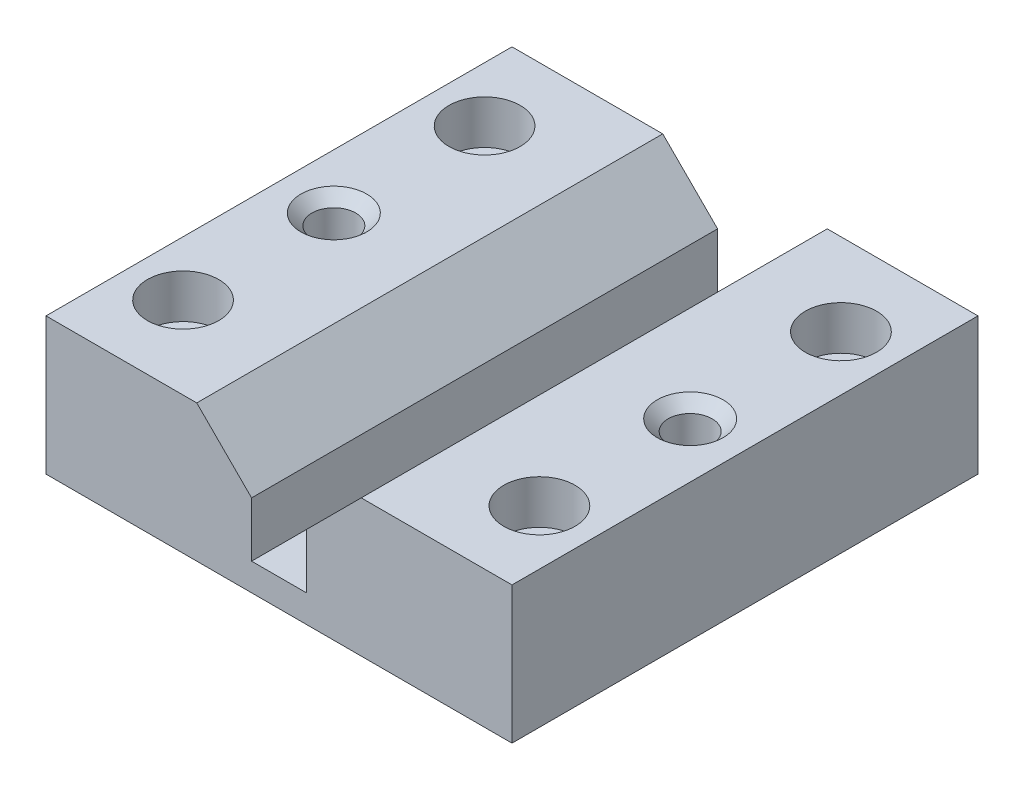
ISO-10303-21;
HEADER;
FILE_DESCRIPTION(('STEP AP214'),'2;1');
FILE_NAME('part.step','',(''),(''),'','','');
FILE_SCHEMA(('AUTOMOTIVE_DESIGN { 1 0 10303 214 1 1 1 1 }'));
ENDSEC;
DATA;
#1=APPLICATION_CONTEXT('core data for automotive mechanical design processes');
#2=APPLICATION_PROTOCOL_DEFINITION('international standard','automotive_design',2000,#1);
#3=PRODUCT_CONTEXT('',#1,'mechanical');
#4=PRODUCT('Part','Part','',(#3));
#5=PRODUCT_RELATED_PRODUCT_CATEGORY('part','',(#4));
#6=PRODUCT_DEFINITION_FORMATION('','',#4);
#7=PRODUCT_DEFINITION_CONTEXT('part definition',#1,'design');
#8=PRODUCT_DEFINITION('design','',#6,#7);
#9=PRODUCT_DEFINITION_SHAPE('','',#8);
#10=(LENGTH_UNIT() NAMED_UNIT(*) SI_UNIT(.MILLI.,.METRE.));
#11=(NAMED_UNIT(*) PLANE_ANGLE_UNIT() SI_UNIT($,.RADIAN.));
#12=(NAMED_UNIT(*) SI_UNIT($,.STERADIAN.) SOLID_ANGLE_UNIT());
#13=UNCERTAINTY_MEASURE_WITH_UNIT(LENGTH_MEASURE(1.E-05),#10,'distance_accuracy_value','');
#14=(GEOMETRIC_REPRESENTATION_CONTEXT(3) GLOBAL_UNCERTAINTY_ASSIGNED_CONTEXT((#13)) GLOBAL_UNIT_ASSIGNED_CONTEXT((#10,
#11,#12)) REPRESENTATION_CONTEXT('',''));
#15=CARTESIAN_POINT('',(0.,0.,0.));
#16=DIRECTION('',(0.,0.,1.));
#17=DIRECTION('',(1.,0.,0.));
#18=AXIS2_PLACEMENT_3D('',#15,#16,#17);
#19=CARTESIAN_POINT('',(-42.5000000000005,0.,42.5000000000005));
#20=DIRECTION('',(1.00000000000001,0.,0.));
#21=DIRECTION('',(0.,0.,-1.00000000000001));
#22=AXIS2_PLACEMENT_3D('',#19,#20,#21);
#23=PLANE('',#22);
#24=DIRECTION('',(0.,-1.,0.));
#25=VECTOR('',#24,1.);
#26=CARTESIAN_POINT('',(-42.5000000000005,0.,-42.5000000000005));
#27=LINE('',#26,#25);
#28=CARTESIAN_POINT('',(-42.5000000000005,25.,-42.5000000000005));
#29=VERTEX_POINT('',#28);
#30=CARTESIAN_POINT('',(-42.5000000000005,0.,-42.5000000000005));
#31=VERTEX_POINT('',#30);
#32=EDGE_CURVE('E144',#29,#31,#27,.T.);
#33=ORIENTED_EDGE('',*,*,#32,.T.);
#34=DIRECTION('',(0.,0.,-1.00000000000001));
#35=VECTOR('',#34,1.);
#36=CARTESIAN_POINT('',(-42.5000000000005,0.,42.5000000000005));
#37=LINE('',#36,#35);
#38=CARTESIAN_POINT('',(-42.5000000000005,0.,42.5000000000005));
#39=VERTEX_POINT('',#38);
#40=EDGE_CURVE('E182',#39,#31,#37,.T.);
#41=ORIENTED_EDGE('',*,*,#40,.F.);
#42=DIRECTION('',(0.,-1.,0.));
#43=VECTOR('',#42,1.);
#44=CARTESIAN_POINT('',(-42.5000000000005,0.,42.5000000000005));
#45=LINE('',#44,#43);
#46=CARTESIAN_POINT('',(-42.5000000000005,25.,42.5000000000005));
#47=VERTEX_POINT('',#46);
#48=EDGE_CURVE('E163',#47,#39,#45,.T.);
#49=ORIENTED_EDGE('',*,*,#48,.F.);
#50=DIRECTION('',(0.,0.,-1.00000000000001));
#51=VECTOR('',#50,1.);
#52=CARTESIAN_POINT('',(-42.5000000000005,25.,42.5000000000005));
#53=LINE('',#52,#51);
#54=EDGE_CURVE('E140',#47,#29,#53,.T.);
#55=ORIENTED_EDGE('',*,*,#54,.T.);
#56=EDGE_LOOP('',(#33,#41,#49,#55));
#57=FACE_BOUND('',#56,.T.);
#58=ADVANCED_FACE('F34',(#57),#23,.F.);
#59=CARTESIAN_POINT('',(42.5000000000005,0.,42.5000000000005));
#60=DIRECTION('',(0.,1.,0.));
#61=DIRECTION('',(0.,0.,1.00000000000001));
#62=AXIS2_PLACEMENT_3D('',#59,#60,#61);
#63=PLANE('',#62);
#64=CARTESIAN_POINT('',(-32.5000000000005,0.,27.5000000000004));
#65=DIRECTION('',(0.,1.,0.));
#66=DIRECTION('',(0.,0.,1.00000000000001));
#67=AXIS2_PLACEMENT_3D('',#64,#65,#66);
#68=CIRCLE('',#67,4.);
#69=CARTESIAN_POINT('',(-32.5000000000005,0.,31.5000000000005));
#70=VERTEX_POINT('',#69);
#71=EDGE_CURVE('E202',#70,#70,#68,.T.);
#72=ORIENTED_EDGE('',*,*,#71,.T.);
#73=EDGE_LOOP('',(#72));
#74=FACE_BOUND('',#73,.T.);
#75=CARTESIAN_POINT('',(32.5000000000005,0.,27.5000000000004));
#76=DIRECTION('',(0.,1.,0.));
#77=DIRECTION('',(0.,0.,1.00000000000001));
#78=AXIS2_PLACEMENT_3D('',#75,#76,#77);
#79=CIRCLE('',#78,4.00000000000001);
#80=CARTESIAN_POINT('',(32.5000000000005,0.,31.5000000000005));
#81=VERTEX_POINT('',#80);
#82=EDGE_CURVE('E198',#81,#81,#79,.T.);
#83=ORIENTED_EDGE('',*,*,#82,.T.);
#84=EDGE_LOOP('',(#83));
#85=FACE_BOUND('',#84,.T.);
#86=CARTESIAN_POINT('',(32.5000000000005,0.,0.));
#87=DIRECTION('',(0.,1.,0.));
#88=DIRECTION('',(0.,0.,1.00000000000001));
#89=AXIS2_PLACEMENT_3D('',#86,#87,#88);
#90=CIRCLE('',#89,4.00000000000001);
#91=CARTESIAN_POINT('',(32.5000000000005,0.,4.00000000000006));
#92=VERTEX_POINT('',#91);
#93=EDGE_CURVE('E197',#92,#92,#90,.T.);
#94=ORIENTED_EDGE('',*,*,#93,.T.);
#95=EDGE_LOOP('',(#94));
#96=FACE_BOUND('',#95,.T.);
#97=CARTESIAN_POINT('',(32.5000000000005,0.,-27.5000000000005));
#98=DIRECTION('',(0.,1.,0.));
#99=DIRECTION('',(0.,0.,1.00000000000001));
#100=AXIS2_PLACEMENT_3D('',#97,#98,#99);
#101=CIRCLE('',#100,4.00000000000001);
#102=CARTESIAN_POINT('',(32.5000000000005,0.,-23.5000000000004));
#103=VERTEX_POINT('',#102);
#104=EDGE_CURVE('E193',#103,#103,#101,.T.);
#105=ORIENTED_EDGE('',*,*,#104,.T.);
#106=EDGE_LOOP('',(#105));
#107=FACE_BOUND('',#106,.T.);
#108=CARTESIAN_POINT('',(-32.5000000000005,0.,-27.5000000000005));
#109=DIRECTION('',(0.,1.,0.));
#110=DIRECTION('',(0.,0.,1.00000000000001));
#111=AXIS2_PLACEMENT_3D('',#108,#109,#110);
#112=CIRCLE('',#111,4.);
#113=CARTESIAN_POINT('',(-32.5000000000005,0.,-23.5000000000004));
#114=VERTEX_POINT('',#113);
#115=EDGE_CURVE('E189',#114,#114,#112,.T.);
#116=ORIENTED_EDGE('',*,*,#115,.T.);
#117=EDGE_LOOP('',(#116));
#118=FACE_BOUND('',#117,.T.);
#119=CARTESIAN_POINT('',(-32.5000000000005,0.,0.));
#120=DIRECTION('',(0.,1.,0.));
#121=DIRECTION('',(0.,0.,1.00000000000001));
#122=AXIS2_PLACEMENT_3D('',#119,#120,#121);
#123=CIRCLE('',#122,4.);
#124=CARTESIAN_POINT('',(-32.5000000000005,0.,4.00000000000006));
#125=VERTEX_POINT('',#124);
#126=EDGE_CURVE('E188',#125,#125,#123,.T.);
#127=ORIENTED_EDGE('',*,*,#126,.T.);
#128=EDGE_LOOP('',(#127));
#129=FACE_BOUND('',#128,.T.);
#130=DIRECTION('',(1.00000000000001,0.,0.));
#131=VECTOR('',#130,1.);
#132=CARTESIAN_POINT('',(42.5000000000005,0.,-42.5000000000005));
#133=LINE('',#132,#131);
#134=CARTESIAN_POINT('',(42.5000000000005,0.,-42.5000000000005));
#135=VERTEX_POINT('',#134);
#136=EDGE_CURVE('E147',#31,#135,#133,.T.);
#137=ORIENTED_EDGE('',*,*,#136,.T.);
#138=DIRECTION('',(0.,0.,-1.00000000000001));
#139=VECTOR('',#138,1.);
#140=CARTESIAN_POINT('',(42.5000000000005,0.,42.5000000000005));
#141=LINE('',#140,#139);
#142=CARTESIAN_POINT('',(42.5000000000005,0.,42.5000000000005));
#143=VERTEX_POINT('',#142);
#144=EDGE_CURVE('E179',#143,#135,#141,.T.);
#145=ORIENTED_EDGE('',*,*,#144,.F.);
#146=DIRECTION('',(1.00000000000001,0.,0.));
#147=VECTOR('',#146,1.);
#148=CARTESIAN_POINT('',(42.5000000000005,0.,42.5000000000005));
#149=LINE('',#148,#147);
#150=EDGE_CURVE('E101',#39,#143,#149,.T.);
#151=ORIENTED_EDGE('',*,*,#150,.F.);
#152=ORIENTED_EDGE('',*,*,#40,.T.);
#153=EDGE_LOOP('',(#137,#145,#151,#152));
#154=FACE_BOUND('',#153,.T.);
#155=ADVANCED_FACE('F223',(#74,#85,#96,#107,#118,#129,#154),#63,.F.);
#156=CARTESIAN_POINT('',(42.5000000000005,0.,42.5000000000005));
#157=DIRECTION('',(-1.00000000000001,0.,0.));
#158=DIRECTION('',(0.,0.,1.00000000000001));
#159=AXIS2_PLACEMENT_3D('',#156,#157,#158);
#160=PLANE('',#159);
#161=DIRECTION('',(0.,1.,0.));
#162=VECTOR('',#161,1.);
#163=CARTESIAN_POINT('',(42.5000000000005,0.,-42.5000000000005));
#164=LINE('',#163,#162);
#165=CARTESIAN_POINT('',(42.5000000000005,25.,-42.5000000000005));
#166=VERTEX_POINT('',#165);
#167=EDGE_CURVE('E150',#135,#166,#164,.T.);
#168=ORIENTED_EDGE('',*,*,#167,.T.);
#169=DIRECTION('',(0.,0.,-1.00000000000001));
#170=VECTOR('',#169,1.);
#171=CARTESIAN_POINT('',(42.5000000000005,25.,42.5000000000005));
#172=LINE('',#171,#170);
#173=CARTESIAN_POINT('',(42.5000000000005,25.,42.5000000000005));
#174=VERTEX_POINT('',#173);
#175=EDGE_CURVE('E176',#174,#166,#172,.T.);
#176=ORIENTED_EDGE('',*,*,#175,.F.);
#177=DIRECTION('',(0.,1.,0.));
#178=VECTOR('',#177,1.);
#179=CARTESIAN_POINT('',(42.5000000000005,0.,42.5000000000005));
#180=LINE('',#179,#178);
#181=EDGE_CURVE('E361',#143,#174,#180,.T.);
#182=ORIENTED_EDGE('',*,*,#181,.F.);
#183=ORIENTED_EDGE('',*,*,#144,.T.);
#184=EDGE_LOOP('',(#168,#176,#182,#183));
#185=FACE_BOUND('',#184,.T.);
#186=ADVANCED_FACE('F229',(#185),#160,.F.);
#187=CARTESIAN_POINT('',(42.5000000000005,25.,42.5000000000005));
#188=DIRECTION('',(0.,-1.,0.));
#189=DIRECTION('',(0.,0.,-1.00000000000001));
#190=AXIS2_PLACEMENT_3D('',#187,#188,#189);
#191=PLANE('',#190);
#192=CARTESIAN_POINT('',(32.5000000000005,25.,0.));
#193=DIRECTION('',(0.,-1.,0.));
#194=DIRECTION('',(0.,0.,-1.00000000000001));
#195=AXIS2_PLACEMENT_3D('',#192,#193,#194);
#196=CIRCLE('',#195,5.99999999999999);
#197=CARTESIAN_POINT('',(32.5000000000005,25.,-6.00000000000008));
#198=VERTEX_POINT('',#197);
#199=EDGE_CURVE('E11',#198,#198,#196,.T.);
#200=ORIENTED_EDGE('',*,*,#199,.T.);
#201=EDGE_LOOP('',(#200));
#202=FACE_BOUND('',#201,.T.);
#203=CARTESIAN_POINT('',(32.5000000000005,25.,-27.5000000000005));
#204=DIRECTION('',(0.,1.,0.));
#205=DIRECTION('',(0.,0.,1.00000000000001));
#206=AXIS2_PLACEMENT_3D('',#203,#204,#205);
#207=CIRCLE('',#206,6.5);
#208=CARTESIAN_POINT('',(32.5000000000005,25.,-21.0000000000004));
#209=VERTEX_POINT('',#208);
#210=EDGE_CURVE('E336',#209,#209,#207,.T.);
#211=ORIENTED_EDGE('',*,*,#210,.F.);
#212=EDGE_LOOP('',(#211));
#213=FACE_BOUND('',#212,.T.);
#214=CARTESIAN_POINT('',(32.5000000000005,25.,27.5000000000004));
#215=DIRECTION('',(0.,1.,0.));
#216=DIRECTION('',(0.,0.,1.00000000000001));
#217=AXIS2_PLACEMENT_3D('',#214,#215,#216);
#218=CIRCLE('',#217,6.5);
#219=CARTESIAN_POINT('',(32.5000000000005,25.,34.0000000000005));
#220=VERTEX_POINT('',#219);
#221=EDGE_CURVE('E340',#220,#220,#218,.T.);
#222=ORIENTED_EDGE('',*,*,#221,.F.);
#223=EDGE_LOOP('',(#222));
#224=FACE_BOUND('',#223,.T.);
#225=DIRECTION('',(-1.00000000000001,0.,0.));
#226=VECTOR('',#225,1.);
#227=CARTESIAN_POINT('',(42.5000000000005,25.,-42.5000000000005));
#228=LINE('',#227,#226);
#229=CARTESIAN_POINT('',(15.0000000000002,25.,-42.5000000000005));
#230=VERTEX_POINT('',#229);
#231=EDGE_CURVE('E152',#166,#230,#228,.T.);
#232=ORIENTED_EDGE('',*,*,#231,.T.);
#233=DIRECTION('',(0.,0.,-1.00000000000001));
#234=VECTOR('',#233,1.);
#235=CARTESIAN_POINT('',(15.0000000000002,25.,42.5000000000005));
#236=LINE('',#235,#234);
#237=CARTESIAN_POINT('',(15.0000000000002,25.,42.5000000000005));
#238=VERTEX_POINT('',#237);
#239=EDGE_CURVE('E173',#238,#230,#236,.T.);
#240=ORIENTED_EDGE('',*,*,#239,.F.);
#241=DIRECTION('',(-1.00000000000001,0.,0.));
#242=VECTOR('',#241,1.);
#243=CARTESIAN_POINT('',(42.5000000000005,25.,42.5000000000005));
#244=LINE('',#243,#242);
#245=EDGE_CURVE('E363',#174,#238,#244,.T.);
#246=ORIENTED_EDGE('',*,*,#245,.F.);
#247=ORIENTED_EDGE('',*,*,#175,.T.);
#248=EDGE_LOOP('',(#232,#240,#246,#247));
#249=FACE_BOUND('',#248,.T.);
#250=ADVANCED_FACE('F235',(#202,#213,#224,#249),#191,.F.);
#251=CARTESIAN_POINT('',(15.0000000000002,25.,42.5000000000005));
#252=DIRECTION('',(0.707106781186559,-0.707106781186544,0.));
#253=DIRECTION('',(0.707106781186551,0.707106781186551,0.));
#254=AXIS2_PLACEMENT_3D('',#251,#252,#253);
#255=PLANE('',#254);
#256=DIRECTION('',(-0.707106781186551,-0.707106781186551,0.));
#257=VECTOR('',#256,1.);
#258=CARTESIAN_POINT('',(15.0000000000002,25.,-42.5000000000005));
#259=LINE('',#258,#257);
#260=CARTESIAN_POINT('',(5.00000000000007,14.9999999999999,-42.5000000000005));
#261=VERTEX_POINT('',#260);
#262=EDGE_CURVE('E154',#230,#261,#259,.T.);
#263=ORIENTED_EDGE('',*,*,#262,.T.);
#264=DIRECTION('',(0.,0.,-1.00000000000001));
#265=VECTOR('',#264,1.);
#266=CARTESIAN_POINT('',(5.00000000000007,14.9999999999999,42.5000000000005));
#267=LINE('',#266,#265);
#268=CARTESIAN_POINT('',(5.00000000000007,14.9999999999999,42.5000000000005));
#269=VERTEX_POINT('',#268);
#270=EDGE_CURVE('E170',#269,#261,#267,.T.);
#271=ORIENTED_EDGE('',*,*,#270,.F.);
#272=DIRECTION('',(-0.707106781186551,-0.707106781186551,0.));
#273=VECTOR('',#272,1.);
#274=CARTESIAN_POINT('',(15.0000000000002,25.,42.5000000000005));
#275=LINE('',#274,#273);
#276=EDGE_CURVE('E365',#238,#269,#275,.T.);
#277=ORIENTED_EDGE('',*,*,#276,.F.);
#278=ORIENTED_EDGE('',*,*,#239,.T.);
#279=EDGE_LOOP('',(#263,#271,#277,#278));
#280=FACE_BOUND('',#279,.T.);
#281=ADVANCED_FACE('F239',(#280),#255,.F.);
#282=CARTESIAN_POINT('',(5.00000000000007,14.9999999999999,42.5000000000005));
#283=DIRECTION('',(1.00000000000001,0.,0.));
#284=DIRECTION('',(0.,1.,0.));
#285=AXIS2_PLACEMENT_3D('',#282,#283,#284);
#286=PLANE('',#285);
#287=DIRECTION('',(0.,-1.,0.));
#288=VECTOR('',#287,1.);
#289=CARTESIAN_POINT('',(5.00000000000007,14.9999999999999,-42.5000000000005));
#290=LINE('',#289,#288);
#291=CARTESIAN_POINT('',(5.00000000000008,5.,-42.5000000000005));
#292=VERTEX_POINT('',#291);
#293=EDGE_CURVE('E156',#261,#292,#290,.T.);
#294=ORIENTED_EDGE('',*,*,#293,.T.);
#295=DIRECTION('',(0.,0.,-1.00000000000001));
#296=VECTOR('',#295,1.);
#297=CARTESIAN_POINT('',(5.00000000000008,5.,42.5000000000005));
#298=LINE('',#297,#296);
#299=CARTESIAN_POINT('',(5.00000000000008,5.,42.5000000000005));
#300=VERTEX_POINT('',#299);
#301=EDGE_CURVE('E167',#300,#292,#298,.T.);
#302=ORIENTED_EDGE('',*,*,#301,.F.);
#303=DIRECTION('',(0.,-1.,0.));
#304=VECTOR('',#303,1.);
#305=CARTESIAN_POINT('',(5.00000000000007,14.9999999999999,42.5000000000005));
#306=LINE('',#305,#304);
#307=EDGE_CURVE('E367',#269,#300,#306,.T.);
#308=ORIENTED_EDGE('',*,*,#307,.F.);
#309=ORIENTED_EDGE('',*,*,#270,.T.);
#310=EDGE_LOOP('',(#294,#302,#308,#309));
#311=FACE_BOUND('',#310,.T.);
#312=ADVANCED_FACE('F243',(#311),#286,.F.);
#313=CARTESIAN_POINT('',(-5.00000000000013,5.,42.5000000000005));
#314=DIRECTION('',(0.,-1.,0.));
#315=DIRECTION('',(0.,0.,-1.00000000000001));
#316=AXIS2_PLACEMENT_3D('',#313,#314,#315);
#317=PLANE('',#316);
#318=DIRECTION('',(-1.00000000000001,0.,0.));
#319=VECTOR('',#318,1.);
#320=CARTESIAN_POINT('',(-5.00000000000013,5.,-42.5000000000005));
#321=LINE('',#320,#319);
#322=CARTESIAN_POINT('',(-5.00000000000013,5.,-42.5000000000005));
#323=VERTEX_POINT('',#322);
#324=EDGE_CURVE('E158',#292,#323,#321,.T.);
#325=ORIENTED_EDGE('',*,*,#324,.T.);
#326=DIRECTION('',(0.,0.,-1.00000000000001));
#327=VECTOR('',#326,1.);
#328=CARTESIAN_POINT('',(-5.00000000000013,5.,42.5000000000005));
#329=LINE('',#328,#327);
#330=CARTESIAN_POINT('',(-5.00000000000013,5.,42.5000000000005));
#331=VERTEX_POINT('',#330);
#332=EDGE_CURVE('E135',#331,#323,#329,.T.);
#333=ORIENTED_EDGE('',*,*,#332,.F.);
#334=DIRECTION('',(-1.00000000000001,0.,0.));
#335=VECTOR('',#334,1.);
#336=CARTESIAN_POINT('',(-5.00000000000013,5.,42.5000000000005));
#337=LINE('',#336,#335);
#338=EDGE_CURVE('E126',#300,#331,#337,.T.);
#339=ORIENTED_EDGE('',*,*,#338,.F.);
#340=ORIENTED_EDGE('',*,*,#301,.T.);
#341=EDGE_LOOP('',(#325,#333,#339,#340));
#342=FACE_BOUND('',#341,.T.);
#343=ADVANCED_FACE('F247',(#342),#317,.F.);
#344=CARTESIAN_POINT('',(-5.00000000000013,14.9999999999999,42.5000000000005));
#345=DIRECTION('',(-1.00000000000001,0.,0.));
#346=DIRECTION('',(0.,-1.,0.));
#347=AXIS2_PLACEMENT_3D('',#344,#345,#346);
#348=PLANE('',#347);
#349=DIRECTION('',(0.,1.,0.));
#350=VECTOR('',#349,1.);
#351=CARTESIAN_POINT('',(-5.00000000000013,14.9999999999999,-42.5000000000005));
#352=LINE('',#351,#350);
#353=CARTESIAN_POINT('',(-5.00000000000013,14.9999999999999,-42.5000000000005));
#354=VERTEX_POINT('',#353);
#355=EDGE_CURVE('E134',#323,#354,#352,.T.);
#356=ORIENTED_EDGE('',*,*,#355,.T.);
#357=DIRECTION('',(0.,0.,-1.00000000000001));
#358=VECTOR('',#357,1.);
#359=CARTESIAN_POINT('',(-5.00000000000013,14.9999999999999,42.5000000000005));
#360=LINE('',#359,#358);
#361=CARTESIAN_POINT('',(-5.00000000000013,14.9999999999999,42.5000000000005));
#362=VERTEX_POINT('',#361);
#363=EDGE_CURVE('E131',#362,#354,#360,.T.);
#364=ORIENTED_EDGE('',*,*,#363,.F.);
#365=DIRECTION('',(0.,1.,0.));
#366=VECTOR('',#365,1.);
#367=CARTESIAN_POINT('',(-5.00000000000013,14.9999999999999,42.5000000000005));
#368=LINE('',#367,#366);
#369=EDGE_CURVE('E120',#331,#362,#368,.T.);
#370=ORIENTED_EDGE('',*,*,#369,.F.);
#371=ORIENTED_EDGE('',*,*,#332,.T.);
#372=EDGE_LOOP('',(#356,#364,#370,#371));
#373=FACE_BOUND('',#372,.T.);
#374=ADVANCED_FACE('F132',(#373),#348,.F.);
#375=CARTESIAN_POINT('',(-15.0000000000002,25.,42.5000000000005));
#376=DIRECTION('',(-0.707106781186559,-0.707106781186544,0.));
#377=DIRECTION('',(0.707106781186551,-0.707106781186551,0.));
#378=AXIS2_PLACEMENT_3D('',#375,#376,#377);
#379=PLANE('',#378);
#380=DIRECTION('',(-0.707106781186551,0.707106781186551,0.));
#381=VECTOR('',#380,1.);
#382=CARTESIAN_POINT('',(-15.0000000000002,25.,-42.5000000000005));
#383=LINE('',#382,#381);
#384=CARTESIAN_POINT('',(-15.0000000000002,25.,-42.5000000000005));
#385=VERTEX_POINT('',#384);
#386=EDGE_CURVE('E86',#354,#385,#383,.T.);
#387=ORIENTED_EDGE('',*,*,#386,.T.);
#388=DIRECTION('',(0.,0.,-1.00000000000001));
#389=VECTOR('',#388,1.);
#390=CARTESIAN_POINT('',(-15.0000000000002,25.,42.5000000000005));
#391=LINE('',#390,#389);
#392=CARTESIAN_POINT('',(-15.0000000000002,25.,42.5000000000005));
#393=VERTEX_POINT('',#392);
#394=EDGE_CURVE('E136',#393,#385,#391,.T.);
#395=ORIENTED_EDGE('',*,*,#394,.F.);
#396=DIRECTION('',(-0.707106781186551,0.707106781186551,0.));
#397=VECTOR('',#396,1.);
#398=CARTESIAN_POINT('',(-15.0000000000002,25.,42.5000000000005));
#399=LINE('',#398,#397);
#400=EDGE_CURVE('E124',#362,#393,#399,.T.);
#401=ORIENTED_EDGE('',*,*,#400,.F.);
#402=ORIENTED_EDGE('',*,*,#363,.T.);
#403=EDGE_LOOP('',(#387,#395,#401,#402));
#404=FACE_BOUND('',#403,.T.);
#405=ADVANCED_FACE('F138',(#404),#379,.F.);
#406=CARTESIAN_POINT('',(-42.5000000000005,25.,42.5000000000005));
#407=DIRECTION('',(0.,-1.,0.));
#408=DIRECTION('',(0.,0.,-1.00000000000001));
#409=AXIS2_PLACEMENT_3D('',#406,#407,#408);
#410=PLANE('',#409);
#411=CARTESIAN_POINT('',(-32.5000000000005,25.,0.));
#412=DIRECTION('',(0.,-1.,0.));
#413=DIRECTION('',(0.,0.,-1.00000000000001));
#414=AXIS2_PLACEMENT_3D('',#411,#412,#413);
#415=CIRCLE('',#414,5.99999999999999);
#416=CARTESIAN_POINT('',(-32.5000000000005,25.,-6.00000000000008));
#417=VERTEX_POINT('',#416);
#418=EDGE_CURVE('E205',#417,#417,#415,.T.);
#419=ORIENTED_EDGE('',*,*,#418,.T.);
#420=EDGE_LOOP('',(#419));
#421=FACE_BOUND('',#420,.T.);
#422=CARTESIAN_POINT('',(-32.5000000000005,25.,27.5000000000004));
#423=DIRECTION('',(0.,1.,0.));
#424=DIRECTION('',(0.,0.,1.00000000000001));
#425=AXIS2_PLACEMENT_3D('',#422,#423,#424);
#426=CIRCLE('',#425,6.5);
#427=CARTESIAN_POINT('',(-32.5000000000005,25.,34.0000000000005));
#428=VERTEX_POINT('',#427);
#429=EDGE_CURVE('E346',#428,#428,#426,.T.);
#430=ORIENTED_EDGE('',*,*,#429,.F.);
#431=EDGE_LOOP('',(#430));
#432=FACE_BOUND('',#431,.T.);
#433=CARTESIAN_POINT('',(-32.5000000000005,25.,-27.5000000000005));
#434=DIRECTION('',(0.,1.,0.));
#435=DIRECTION('',(0.,0.,1.00000000000001));
#436=AXIS2_PLACEMENT_3D('',#433,#434,#435);
#437=CIRCLE('',#436,6.5);
#438=CARTESIAN_POINT('',(-32.5000000000005,25.,-21.0000000000004));
#439=VERTEX_POINT('',#438);
#440=EDGE_CURVE('E352',#439,#439,#437,.T.);
#441=ORIENTED_EDGE('',*,*,#440,.F.);
#442=EDGE_LOOP('',(#441));
#443=FACE_BOUND('',#442,.T.);
#444=DIRECTION('',(-1.00000000000001,0.,0.));
#445=VECTOR('',#444,1.);
#446=CARTESIAN_POINT('',(-42.5000000000005,25.,-42.5000000000005));
#447=LINE('',#446,#445);
#448=EDGE_CURVE('E92',#385,#29,#447,.T.);
#449=ORIENTED_EDGE('',*,*,#448,.T.);
#450=ORIENTED_EDGE('',*,*,#54,.F.);
#451=DIRECTION('',(-1.00000000000001,0.,0.));
#452=VECTOR('',#451,1.);
#453=CARTESIAN_POINT('',(-42.5000000000005,25.,42.5000000000005));
#454=LINE('',#453,#452);
#455=EDGE_CURVE('E51',#393,#47,#454,.T.);
#456=ORIENTED_EDGE('',*,*,#455,.F.);
#457=ORIENTED_EDGE('',*,*,#394,.T.);
#458=EDGE_LOOP('',(#449,#450,#456,#457));
#459=FACE_BOUND('',#458,.T.);
#460=ADVANCED_FACE('F256',(#421,#432,#443,#459),#410,.F.);
#461=CARTESIAN_POINT('',(0.,0.,42.5000000000005));
#462=DIRECTION('',(0.,0.,-1.00000000000001));
#463=DIRECTION('',(-1.00000000000001,0.,0.));
#464=AXIS2_PLACEMENT_3D('',#461,#462,#463);
#465=PLANE('',#464);
#466=ORIENTED_EDGE('',*,*,#48,.T.);
#467=ORIENTED_EDGE('',*,*,#150,.T.);
#468=ORIENTED_EDGE('',*,*,#181,.T.);
#469=ORIENTED_EDGE('',*,*,#245,.T.);
#470=ORIENTED_EDGE('',*,*,#276,.T.);
#471=ORIENTED_EDGE('',*,*,#307,.T.);
#472=ORIENTED_EDGE('',*,*,#338,.T.);
#473=ORIENTED_EDGE('',*,*,#369,.T.);
#474=ORIENTED_EDGE('',*,*,#400,.T.);
#475=ORIENTED_EDGE('',*,*,#455,.T.);
#476=EDGE_LOOP('',(#466,#467,#468,#469,#470,#471,#472,#473,#474,#475));
#477=FACE_BOUND('',#476,.T.);
#478=ADVANCED_FACE('F122',(#477),#465,.F.);
#479=CARTESIAN_POINT('',(0.,0.,-42.5000000000005));
#480=DIRECTION('',(0.,0.,-1.00000000000001));
#481=DIRECTION('',(-1.00000000000001,0.,0.));
#482=AXIS2_PLACEMENT_3D('',#479,#480,#481);
#483=PLANE('',#482);
#484=ORIENTED_EDGE('',*,*,#32,.F.);
#485=ORIENTED_EDGE('',*,*,#448,.F.);
#486=ORIENTED_EDGE('',*,*,#386,.F.);
#487=ORIENTED_EDGE('',*,*,#355,.F.);
#488=ORIENTED_EDGE('',*,*,#324,.F.);
#489=ORIENTED_EDGE('',*,*,#293,.F.);
#490=ORIENTED_EDGE('',*,*,#262,.F.);
#491=ORIENTED_EDGE('',*,*,#231,.F.);
#492=ORIENTED_EDGE('',*,*,#167,.F.);
#493=ORIENTED_EDGE('',*,*,#136,.F.);
#494=EDGE_LOOP('',(#484,#485,#486,#487,#488,#489,#490,#491,#492,#493));
#495=FACE_BOUND('',#494,.T.);
#496=ADVANCED_FACE('F260',(#495),#483,.T.);
#497=CARTESIAN_POINT('',(-32.5000000000005,17.,-27.5000000000005));
#498=DIRECTION('',(0.,1.,0.));
#499=DIRECTION('',(0.,0.,1.00000000000001));
#500=AXIS2_PLACEMENT_3D('',#497,#498,#499);
#501=CYLINDRICAL_SURFACE('',#500,6.5);
#502=CARTESIAN_POINT('',(-32.5000000000005,17.,-27.5000000000005));
#503=DIRECTION('',(0.,1.,0.));
#504=DIRECTION('',(0.,0.,1.00000000000001));
#505=AXIS2_PLACEMENT_3D('',#502,#503,#504);
#506=CIRCLE('',#505,6.5);
#507=CARTESIAN_POINT('',(-32.5000000000005,17.,-21.0000000000004));
#508=VERTEX_POINT('',#507);
#509=EDGE_CURVE('E148',#508,#508,#506,.T.);
#510=ORIENTED_EDGE('',*,*,#509,.F.);
#511=EDGE_LOOP('',(#510));
#512=FACE_BOUND('',#511,.T.);
#513=ORIENTED_EDGE('',*,*,#440,.T.);
#514=EDGE_LOOP('',(#513));
#515=FACE_BOUND('',#514,.T.);
#516=ADVANCED_FACE('F263',(#512,#515),#501,.F.);
#517=CARTESIAN_POINT('',(-32.5000000000005,17.,-27.5000000000005));
#518=DIRECTION('',(0.,1.,0.));
#519=DIRECTION('',(0.,0.,1.00000000000001));
#520=AXIS2_PLACEMENT_3D('',#517,#518,#519);
#521=PLANE('',#520);
#522=CARTESIAN_POINT('',(-32.5000000000005,17.,-27.5000000000005));
#523=DIRECTION('',(0.,1.,0.));
#524=DIRECTION('',(0.,0.,1.00000000000001));
#525=AXIS2_PLACEMENT_3D('',#522,#523,#524);
#526=CIRCLE('',#525,4.);
#527=CARTESIAN_POINT('',(-32.5000000000005,17.,-23.5000000000004));
#528=VERTEX_POINT('',#527);
#529=EDGE_CURVE('E185',#528,#528,#526,.T.);
#530=ORIENTED_EDGE('',*,*,#529,.F.);
#531=EDGE_LOOP('',(#530));
#532=FACE_BOUND('',#531,.T.);
#533=ORIENTED_EDGE('',*,*,#509,.T.);
#534=EDGE_LOOP('',(#533));
#535=FACE_BOUND('',#534,.T.);
#536=ADVANCED_FACE('F269',(#532,#535),#521,.T.);
#537=CARTESIAN_POINT('',(-32.5000000000005,17.,27.5000000000004));
#538=DIRECTION('',(0.,1.,0.));
#539=DIRECTION('',(0.,0.,1.00000000000001));
#540=AXIS2_PLACEMENT_3D('',#537,#538,#539);
#541=CYLINDRICAL_SURFACE('',#540,6.5);
#542=CARTESIAN_POINT('',(-32.5000000000005,17.,27.5000000000004));
#543=DIRECTION('',(0.,1.,0.));
#544=DIRECTION('',(0.,0.,1.00000000000001));
#545=AXIS2_PLACEMENT_3D('',#542,#543,#544);
#546=CIRCLE('',#545,6.5);
#547=CARTESIAN_POINT('',(-32.5000000000005,17.,34.0000000000005));
#548=VERTEX_POINT('',#547);
#549=EDGE_CURVE('E349',#548,#548,#546,.T.);
#550=ORIENTED_EDGE('',*,*,#549,.F.);
#551=EDGE_LOOP('',(#550));
#552=FACE_BOUND('',#551,.T.);
#553=ORIENTED_EDGE('',*,*,#429,.T.);
#554=EDGE_LOOP('',(#553));
#555=FACE_BOUND('',#554,.T.);
#556=ADVANCED_FACE('F273',(#552,#555),#541,.F.);
#557=CARTESIAN_POINT('',(-32.5000000000005,17.,27.5000000000004));
#558=DIRECTION('',(0.,1.,0.));
#559=DIRECTION('',(0.,0.,1.00000000000001));
#560=AXIS2_PLACEMENT_3D('',#557,#558,#559);
#561=PLANE('',#560);
#562=CARTESIAN_POINT('',(-32.5000000000005,17.,27.5000000000004));
#563=DIRECTION('',(0.,1.,0.));
#564=DIRECTION('',(0.,0.,1.00000000000001));
#565=AXIS2_PLACEMENT_3D('',#562,#563,#564);
#566=CIRCLE('',#565,4.);
#567=CARTESIAN_POINT('',(-32.5000000000005,17.,31.5000000000005));
#568=VERTEX_POINT('',#567);
#569=EDGE_CURVE('E199',#568,#568,#566,.T.);
#570=ORIENTED_EDGE('',*,*,#569,.F.);
#571=EDGE_LOOP('',(#570));
#572=FACE_BOUND('',#571,.T.);
#573=ORIENTED_EDGE('',*,*,#549,.T.);
#574=EDGE_LOOP('',(#573));
#575=FACE_BOUND('',#574,.T.);
#576=ADVANCED_FACE('F277',(#572,#575),#561,.T.);
#577=CARTESIAN_POINT('',(32.5000000000005,17.,27.5000000000004));
#578=DIRECTION('',(0.,1.,0.));
#579=DIRECTION('',(0.,0.,1.00000000000001));
#580=AXIS2_PLACEMENT_3D('',#577,#578,#579);
#581=CYLINDRICAL_SURFACE('',#580,6.5);
#582=CARTESIAN_POINT('',(32.5000000000005,17.,27.5000000000004));
#583=DIRECTION('',(0.,1.,0.));
#584=DIRECTION('',(0.,0.,1.00000000000001));
#585=AXIS2_PLACEMENT_3D('',#582,#583,#584);
#586=CIRCLE('',#585,6.5);
#587=CARTESIAN_POINT('',(32.5000000000005,17.,34.0000000000005));
#588=VERTEX_POINT('',#587);
#589=EDGE_CURVE('E343',#588,#588,#586,.T.);
#590=ORIENTED_EDGE('',*,*,#589,.F.);
#591=EDGE_LOOP('',(#590));
#592=FACE_BOUND('',#591,.T.);
#593=ORIENTED_EDGE('',*,*,#221,.T.);
#594=EDGE_LOOP('',(#593));
#595=FACE_BOUND('',#594,.T.);
#596=ADVANCED_FACE('F281',(#592,#595),#581,.F.);
#597=CARTESIAN_POINT('',(32.5000000000005,17.,27.5000000000004));
#598=DIRECTION('',(0.,1.,0.));
#599=DIRECTION('',(0.,0.,1.00000000000001));
#600=AXIS2_PLACEMENT_3D('',#597,#598,#599);
#601=PLANE('',#600);
#602=CARTESIAN_POINT('',(32.5000000000005,17.,27.5000000000004));
#603=DIRECTION('',(0.,1.,0.));
#604=DIRECTION('',(0.,0.,1.00000000000001));
#605=AXIS2_PLACEMENT_3D('',#602,#603,#604);
#606=CIRCLE('',#605,4.00000000000001);
#607=CARTESIAN_POINT('',(32.5000000000005,17.,31.5000000000005));
#608=VERTEX_POINT('',#607);
#609=EDGE_CURVE('E194',#608,#608,#606,.T.);
#610=ORIENTED_EDGE('',*,*,#609,.F.);
#611=EDGE_LOOP('',(#610));
#612=FACE_BOUND('',#611,.T.);
#613=ORIENTED_EDGE('',*,*,#589,.T.);
#614=EDGE_LOOP('',(#613));
#615=FACE_BOUND('',#614,.T.);
#616=ADVANCED_FACE('F285',(#612,#615),#601,.T.);
#617=CARTESIAN_POINT('',(32.5000000000005,17.,-27.5000000000005));
#618=DIRECTION('',(0.,1.,0.));
#619=DIRECTION('',(0.,0.,1.00000000000001));
#620=AXIS2_PLACEMENT_3D('',#617,#618,#619);
#621=CYLINDRICAL_SURFACE('',#620,6.5);
#622=CARTESIAN_POINT('',(32.5000000000005,17.,-27.5000000000005));
#623=DIRECTION('',(0.,1.,0.));
#624=DIRECTION('',(0.,0.,1.00000000000001));
#625=AXIS2_PLACEMENT_3D('',#622,#623,#624);
#626=CIRCLE('',#625,6.5);
#627=CARTESIAN_POINT('',(32.5000000000005,17.,-21.0000000000004));
#628=VERTEX_POINT('',#627);
#629=EDGE_CURVE('E337',#628,#628,#626,.T.);
#630=ORIENTED_EDGE('',*,*,#629,.F.);
#631=EDGE_LOOP('',(#630));
#632=FACE_BOUND('',#631,.T.);
#633=ORIENTED_EDGE('',*,*,#210,.T.);
#634=EDGE_LOOP('',(#633));
#635=FACE_BOUND('',#634,.T.);
#636=ADVANCED_FACE('F289',(#632,#635),#621,.F.);
#637=CARTESIAN_POINT('',(32.5000000000005,17.,-27.5000000000005));
#638=DIRECTION('',(0.,1.,0.));
#639=DIRECTION('',(0.,0.,1.00000000000001));
#640=AXIS2_PLACEMENT_3D('',#637,#638,#639);
#641=PLANE('',#640);
#642=CARTESIAN_POINT('',(32.5000000000005,17.,-27.5000000000005));
#643=DIRECTION('',(0.,1.,0.));
#644=DIRECTION('',(0.,0.,1.00000000000001));
#645=AXIS2_PLACEMENT_3D('',#642,#643,#644);
#646=CIRCLE('',#645,4.00000000000001);
#647=CARTESIAN_POINT('',(32.5000000000005,17.,-23.5000000000004));
#648=VERTEX_POINT('',#647);
#649=EDGE_CURVE('E190',#648,#648,#646,.T.);
#650=ORIENTED_EDGE('',*,*,#649,.F.);
#651=EDGE_LOOP('',(#650));
#652=FACE_BOUND('',#651,.T.);
#653=ORIENTED_EDGE('',*,*,#629,.T.);
#654=EDGE_LOOP('',(#653));
#655=FACE_BOUND('',#654,.T.);
#656=ADVANCED_FACE('F293',(#652,#655),#641,.T.);
#657=CARTESIAN_POINT('',(-32.5000000000005,0.,0.));
#658=DIRECTION('',(0.,1.,0.));
#659=DIRECTION('',(0.,0.,1.00000000000001));
#660=AXIS2_PLACEMENT_3D('',#657,#658,#659);
#661=CYLINDRICAL_SURFACE('',#660,4.);
#662=CARTESIAN_POINT('',(-32.5000000000005,23.,0.));
#663=DIRECTION('',(0.,-1.,0.));
#664=DIRECTION('',(0.,0.,-1.00000000000001));
#665=AXIS2_PLACEMENT_3D('',#662,#663,#664);
#666=CIRCLE('',#665,4.);
#667=CARTESIAN_POINT('',(-32.5000000000005,23.,-4.00000000000006));
#668=VERTEX_POINT('',#667);
#669=EDGE_CURVE('E184',#668,#668,#666,.F.);
#670=ORIENTED_EDGE('',*,*,#669,.T.);
#671=EDGE_LOOP('',(#670));
#672=FACE_BOUND('',#671,.T.);
#673=ORIENTED_EDGE('',*,*,#126,.F.);
#674=EDGE_LOOP('',(#673));
#675=FACE_BOUND('',#674,.T.);
#676=ADVANCED_FACE('F297',(#672,#675),#661,.F.);
#677=CARTESIAN_POINT('',(-32.5000000000005,0.,-27.5000000000005));
#678=DIRECTION('',(0.,1.,0.));
#679=DIRECTION('',(0.,0.,1.00000000000001));
#680=AXIS2_PLACEMENT_3D('',#677,#678,#679);
#681=CYLINDRICAL_SURFACE('',#680,4.);
#682=ORIENTED_EDGE('',*,*,#529,.T.);
#683=EDGE_LOOP('',(#682));
#684=FACE_BOUND('',#683,.T.);
#685=ORIENTED_EDGE('',*,*,#115,.F.);
#686=EDGE_LOOP('',(#685));
#687=FACE_BOUND('',#686,.T.);
#688=ADVANCED_FACE('F301',(#684,#687),#681,.F.);
#689=CARTESIAN_POINT('',(32.5000000000005,0.,-27.5000000000005));
#690=DIRECTION('',(0.,1.,0.));
#691=DIRECTION('',(0.,0.,1.00000000000001));
#692=AXIS2_PLACEMENT_3D('',#689,#690,#691);
#693=CYLINDRICAL_SURFACE('',#692,4.00000000000001);
#694=ORIENTED_EDGE('',*,*,#649,.T.);
#695=EDGE_LOOP('',(#694));
#696=FACE_BOUND('',#695,.T.);
#697=ORIENTED_EDGE('',*,*,#104,.F.);
#698=EDGE_LOOP('',(#697));
#699=FACE_BOUND('',#698,.T.);
#700=ADVANCED_FACE('F305',(#696,#699),#693,.F.);
#701=CARTESIAN_POINT('',(32.5000000000005,0.,0.));
#702=DIRECTION('',(0.,1.,0.));
#703=DIRECTION('',(0.,0.,1.00000000000001));
#704=AXIS2_PLACEMENT_3D('',#701,#702,#703);
#705=CYLINDRICAL_SURFACE('',#704,4.00000000000001);
#706=CARTESIAN_POINT('',(32.5000000000005,23.,0.));
#707=DIRECTION('',(0.,-1.,0.));
#708=DIRECTION('',(0.,0.,-1.00000000000001));
#709=AXIS2_PLACEMENT_3D('',#706,#707,#708);
#710=CIRCLE('',#709,4.00000000000001);
#711=CARTESIAN_POINT('',(32.5000000000005,23.,-4.00000000000006));
#712=VERTEX_POINT('',#711);
#713=EDGE_CURVE('E43',#712,#712,#710,.F.);
#714=ORIENTED_EDGE('',*,*,#713,.T.);
#715=EDGE_LOOP('',(#714));
#716=FACE_BOUND('',#715,.T.);
#717=ORIENTED_EDGE('',*,*,#93,.F.);
#718=EDGE_LOOP('',(#717));
#719=FACE_BOUND('',#718,.T.);
#720=ADVANCED_FACE('F210',(#716,#719),#705,.F.);
#721=CARTESIAN_POINT('',(32.5000000000005,0.,27.5000000000004));
#722=DIRECTION('',(0.,1.,0.));
#723=DIRECTION('',(0.,0.,1.00000000000001));
#724=AXIS2_PLACEMENT_3D('',#721,#722,#723);
#725=CYLINDRICAL_SURFACE('',#724,4.00000000000001);
#726=ORIENTED_EDGE('',*,*,#609,.T.);
#727=EDGE_LOOP('',(#726));
#728=FACE_BOUND('',#727,.T.);
#729=ORIENTED_EDGE('',*,*,#82,.F.);
#730=EDGE_LOOP('',(#729));
#731=FACE_BOUND('',#730,.T.);
#732=ADVANCED_FACE('F312',(#728,#731),#725,.F.);
#733=CARTESIAN_POINT('',(-32.5000000000005,0.,27.5000000000004));
#734=DIRECTION('',(0.,1.,0.));
#735=DIRECTION('',(0.,0.,1.00000000000001));
#736=AXIS2_PLACEMENT_3D('',#733,#734,#735);
#737=CYLINDRICAL_SURFACE('',#736,4.);
#738=ORIENTED_EDGE('',*,*,#569,.T.);
#739=EDGE_LOOP('',(#738));
#740=FACE_BOUND('',#739,.T.);
#741=ORIENTED_EDGE('',*,*,#71,.F.);
#742=EDGE_LOOP('',(#741));
#743=FACE_BOUND('',#742,.T.);
#744=ADVANCED_FACE('F219',(#740,#743),#737,.F.);
#745=CARTESIAN_POINT('',(-32.5000000000005,23.,0.));
#746=DIRECTION('',(0.,1.,0.));
#747=DIRECTION('',(0.,0.,1.00000000000001));
#748=AXIS2_PLACEMENT_3D('',#745,#746,#747);
#749=CONICAL_SURFACE('',#748,4.,0.785398163397449);
#750=ORIENTED_EDGE('',*,*,#418,.F.);
#751=EDGE_LOOP('',(#750));
#752=FACE_BOUND('',#751,.T.);
#753=ORIENTED_EDGE('',*,*,#669,.F.);
#754=EDGE_LOOP('',(#753));
#755=FACE_BOUND('',#754,.T.);
#756=ADVANCED_FACE('F214',(#752,#755),#749,.F.);
#757=CARTESIAN_POINT('',(32.5000000000005,23.,0.));
#758=DIRECTION('',(0.,1.,0.));
#759=DIRECTION('',(0.,0.,1.00000000000001));
#760=AXIS2_PLACEMENT_3D('',#757,#758,#759);
#761=CONICAL_SURFACE('',#760,4.00000000000001,0.785398163397449);
#762=ORIENTED_EDGE('',*,*,#199,.F.);
#763=EDGE_LOOP('',(#762));
#764=FACE_BOUND('',#763,.T.);
#765=ORIENTED_EDGE('',*,*,#713,.F.);
#766=EDGE_LOOP('',(#765));
#767=FACE_BOUND('',#766,.T.);
#768=ADVANCED_FACE('F36',(#764,#767),#761,.F.);
#769=CLOSED_SHELL('',(#58,#155,#186,#250,#281,#312,#343,#374,#405,#460,#478,#496,#516,#536,#556,
#576,#596,#616,#636,#656,#676,#688,#700,#720,#732,#744,#756,#768));
#770=MANIFOLD_SOLID_BREP('B2',#769);
#771=ADVANCED_BREP_SHAPE_REPRESENTATION('',(#18,#770),#14);
#772=SHAPE_DEFINITION_REPRESENTATION(#9,#771);
ENDSEC;
END-ISO-10303-21;
